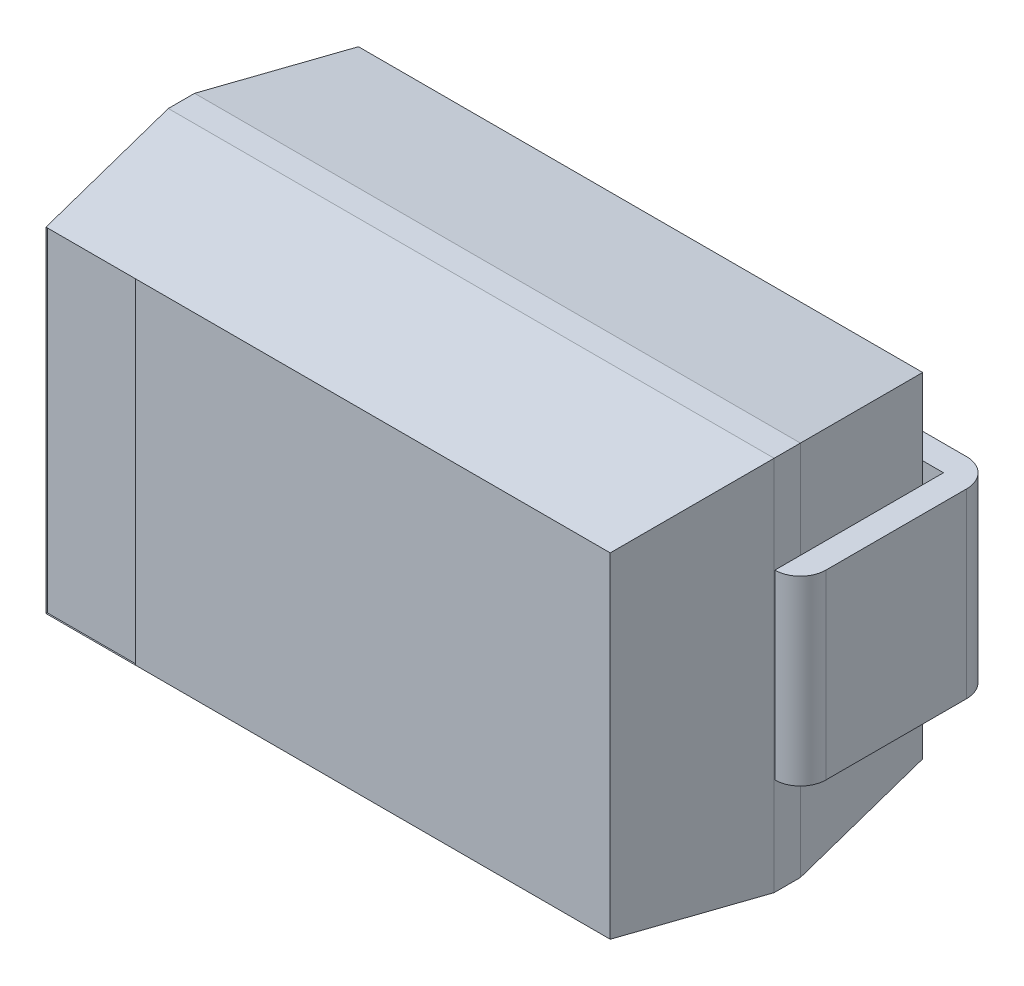
ISO-10303-21;
HEADER;
FILE_DESCRIPTION(('STEP AP214'),'2;1');
FILE_NAME('part.step','',(''),(''),'','','');
FILE_SCHEMA(('AUTOMOTIVE_DESIGN { 1 0 10303 214 1 1 1 1 }'));
ENDSEC;
DATA;
#1=APPLICATION_CONTEXT('core data for automotive mechanical design processes');
#2=APPLICATION_PROTOCOL_DEFINITION('international standard','automotive_design',2000,#1);
#3=PRODUCT_CONTEXT('',#1,'mechanical');
#4=PRODUCT('Part','Part','',(#3));
#5=PRODUCT_RELATED_PRODUCT_CATEGORY('part','',(#4));
#6=PRODUCT_DEFINITION_FORMATION('','',#4);
#7=PRODUCT_DEFINITION_CONTEXT('part definition',#1,'design');
#8=PRODUCT_DEFINITION('design','',#6,#7);
#9=PRODUCT_DEFINITION_SHAPE('','',#8);
#10=(LENGTH_UNIT() NAMED_UNIT(*) SI_UNIT(.MILLI.,.METRE.));
#11=(NAMED_UNIT(*) PLANE_ANGLE_UNIT() SI_UNIT($,.RADIAN.));
#12=(NAMED_UNIT(*) SI_UNIT($,.STERADIAN.) SOLID_ANGLE_UNIT());
#13=UNCERTAINTY_MEASURE_WITH_UNIT(LENGTH_MEASURE(1.E-05),#10,'distance_accuracy_value','');
#14=(GEOMETRIC_REPRESENTATION_CONTEXT(3) GLOBAL_UNCERTAINTY_ASSIGNED_CONTEXT((#13)) GLOBAL_UNIT_ASSIGNED_CONTEXT((#10,
#11,#12)) REPRESENTATION_CONTEXT('',''));
#15=CARTESIAN_POINT('',(0.,0.,0.));
#16=DIRECTION('',(0.,0.,1.));
#17=DIRECTION('',(1.,0.,0.));
#18=AXIS2_PLACEMENT_3D('',#15,#16,#17);
#19=CARTESIAN_POINT('',(1.44,-0.7125,0.));
#20=DIRECTION('',(-1.,0.,0.));
#21=DIRECTION('',(0.,0.,-1.));
#22=AXIS2_PLACEMENT_3D('',#19,#20,#21);
#23=PLANE('',#22);
#24=DIRECTION('',(0.,1.,0.));
#25=VECTOR('',#24,1.);
#26=CARTESIAN_POINT('',(1.44,-0.7125,0.));
#27=LINE('',#26,#25);
#28=CARTESIAN_POINT('',(1.44,-0.7125,0.));
#29=VERTEX_POINT('',#28);
#30=CARTESIAN_POINT('',(1.44,0.7125,0.));
#31=VERTEX_POINT('',#30);
#32=EDGE_CURVE('E51',#29,#31,#27,.T.);
#33=ORIENTED_EDGE('',*,*,#32,.F.);
#34=DIRECTION('',(0.,0.,-1.));
#35=VECTOR('',#34,1.);
#36=CARTESIAN_POINT('',(1.44,-0.7125,0.));
#37=LINE('',#36,#35);
#38=CARTESIAN_POINT('',(1.44,-0.7125,0.2));
#39=VERTEX_POINT('',#38);
#40=EDGE_CURVE('E164',#39,#29,#37,.T.);
#41=ORIENTED_EDGE('',*,*,#40,.F.);
#42=DIRECTION('',(0.,1.,0.));
#43=VECTOR('',#42,1.);
#44=CARTESIAN_POINT('',(1.44,-0.7125,0.2));
#45=LINE('',#44,#43);
#46=CARTESIAN_POINT('',(1.44,0.7125,0.2));
#47=VERTEX_POINT('',#46);
#48=EDGE_CURVE('E12',#39,#47,#45,.T.);
#49=ORIENTED_EDGE('',*,*,#48,.T.);
#50=DIRECTION('',(0.,0.,-1.));
#51=VECTOR('',#50,1.);
#52=CARTESIAN_POINT('',(1.44,0.7125,0.));
#53=LINE('',#52,#51);
#54=EDGE_CURVE('E112',#47,#31,#53,.T.);
#55=ORIENTED_EDGE('',*,*,#54,.T.);
#56=EDGE_LOOP('',(#33,#41,#49,#55));
#57=FACE_BOUND('',#56,.T.);
#58=ADVANCED_FACE('F48',(#57),#23,.T.);
#59=CARTESIAN_POINT('',(1.44,-0.7125,0.2));
#60=DIRECTION('',(0.,0.,1.));
#61=DIRECTION('',(-1.,0.,0.));
#62=AXIS2_PLACEMENT_3D('',#59,#60,#61);
#63=PLANE('',#62);
#64=ORIENTED_EDGE('',*,*,#48,.F.);
#65=DIRECTION('',(-1.,0.,0.));
#66=VECTOR('',#65,1.);
#67=CARTESIAN_POINT('',(1.44,-0.7125,0.2));
#68=LINE('',#67,#66);
#69=CARTESIAN_POINT('',(2.375,-0.7125,0.2));
#70=VERTEX_POINT('',#69);
#71=EDGE_CURVE('E64',#70,#39,#68,.T.);
#72=ORIENTED_EDGE('',*,*,#71,.F.);
#73=DIRECTION('',(0.,1.,0.));
#74=VECTOR('',#73,1.);
#75=CARTESIAN_POINT('',(2.375,-0.7125,0.2));
#76=LINE('',#75,#74);
#77=CARTESIAN_POINT('',(2.375,0.7125,0.2));
#78=VERTEX_POINT('',#77);
#79=EDGE_CURVE('E56',#70,#78,#76,.T.);
#80=ORIENTED_EDGE('',*,*,#79,.T.);
#81=DIRECTION('',(-1.,0.,0.));
#82=VECTOR('',#81,1.);
#83=CARTESIAN_POINT('',(1.44,0.7125,0.2));
#84=LINE('',#83,#82);
#85=EDGE_CURVE('E162',#78,#47,#84,.T.);
#86=ORIENTED_EDGE('',*,*,#85,.T.);
#87=EDGE_LOOP('',(#64,#72,#80,#86));
#88=FACE_BOUND('',#87,.T.);
#89=ADVANCED_FACE('F176',(#88),#63,.T.);
#90=CARTESIAN_POINT('',(2.375,-0.7125,0.2));
#91=DIRECTION('',(-1.,0.,0.));
#92=DIRECTION('',(0.,0.,-1.));
#93=AXIS2_PLACEMENT_3D('',#90,#91,#92);
#94=PLANE('',#93);
#95=ORIENTED_EDGE('',*,*,#79,.F.);
#96=DIRECTION('',(0.,0.,-1.));
#97=VECTOR('',#96,1.);
#98=CARTESIAN_POINT('',(2.375,-0.7125,1.32200000000003));
#99=LINE('',#98,#97);
#100=CARTESIAN_POINT('',(2.375,-0.7125,1.52200000000003));
#101=VERTEX_POINT('',#100);
#102=EDGE_CURVE('E69',#101,#70,#99,.T.);
#103=ORIENTED_EDGE('',*,*,#102,.F.);
#104=DIRECTION('',(0.,1.,0.));
#105=VECTOR('',#104,1.);
#106=CARTESIAN_POINT('',(2.375,-0.7125,1.52200000000003));
#107=LINE('',#106,#105);
#108=CARTESIAN_POINT('',(2.375,0.7125,1.52200000000003));
#109=VERTEX_POINT('',#108);
#110=EDGE_CURVE('E135',#101,#109,#107,.T.);
#111=ORIENTED_EDGE('',*,*,#110,.T.);
#112=DIRECTION('',(0.,0.,-1.));
#113=VECTOR('',#112,1.);
#114=CARTESIAN_POINT('',(2.375,0.7125,1.32200000000003));
#115=LINE('',#114,#113);
#116=EDGE_CURVE('E158',#109,#78,#115,.T.);
#117=ORIENTED_EDGE('',*,*,#116,.T.);
#118=EDGE_LOOP('',(#95,#103,#111,#117));
#119=FACE_BOUND('',#118,.T.);
#120=ADVANCED_FACE('F174',(#119),#94,.T.);
#121=CARTESIAN_POINT('',(2.375,-0.7125,1.32200000000003));
#122=DIRECTION('',(0.,1.,0.));
#123=DIRECTION('',(0.,0.,1.));
#124=AXIS2_PLACEMENT_3D('',#121,#122,#123);
#125=CYLINDRICAL_SURFACE('',#124,0.2);
#126=ORIENTED_EDGE('',*,*,#110,.F.);
#127=CARTESIAN_POINT('',(2.375,-0.7125,1.32200000000003));
#128=DIRECTION('',(0.,-1.,0.));
#129=DIRECTION('',(0.,0.,-1.));
#130=AXIS2_PLACEMENT_3D('',#127,#128,#129);
#131=CIRCLE('',#130,0.2);
#132=CARTESIAN_POINT('',(2.575,-0.7125,1.32200000000003));
#133=VERTEX_POINT('',#132);
#134=EDGE_CURVE('E129',#133,#101,#131,.T.);
#135=ORIENTED_EDGE('',*,*,#134,.F.);
#136=DIRECTION('',(0.,1.,0.));
#137=VECTOR('',#136,1.);
#138=CARTESIAN_POINT('',(2.575,-0.7125,1.32200000000003));
#139=LINE('',#138,#137);
#140=CARTESIAN_POINT('',(2.575,0.7125,1.32200000000003));
#141=VERTEX_POINT('',#140);
#142=EDGE_CURVE('E138',#133,#141,#139,.T.);
#143=ORIENTED_EDGE('',*,*,#142,.T.);
#144=CARTESIAN_POINT('',(2.375,0.7125,1.32200000000003));
#145=DIRECTION('',(0.,-1.,0.));
#146=DIRECTION('',(0.,0.,-1.));
#147=AXIS2_PLACEMENT_3D('',#144,#145,#146);
#148=CIRCLE('',#147,0.2);
#149=EDGE_CURVE('E156',#141,#109,#148,.T.);
#150=ORIENTED_EDGE('',*,*,#149,.T.);
#151=EDGE_LOOP('',(#126,#135,#143,#150));
#152=FACE_BOUND('',#151,.T.);
#153=ADVANCED_FACE('F172',(#152),#125,.T.);
#154=CARTESIAN_POINT('',(2.575,-0.7125,1.32200000000003));
#155=DIRECTION('',(1.,0.,0.));
#156=DIRECTION('',(0.,0.,1.));
#157=AXIS2_PLACEMENT_3D('',#154,#155,#156);
#158=PLANE('',#157);
#159=ORIENTED_EDGE('',*,*,#142,.F.);
#160=DIRECTION('',(0.,0.,1.));
#161=VECTOR('',#160,1.);
#162=CARTESIAN_POINT('',(2.575,-0.7125,1.32200000000003));
#163=LINE('',#162,#161);
#164=CARTESIAN_POINT('',(2.575,-0.7125,0.22));
#165=VERTEX_POINT('',#164);
#166=EDGE_CURVE('E149',#165,#133,#163,.T.);
#167=ORIENTED_EDGE('',*,*,#166,.F.);
#168=DIRECTION('',(0.,1.,0.));
#169=VECTOR('',#168,1.);
#170=CARTESIAN_POINT('',(2.575,-0.7125,0.22));
#171=LINE('',#170,#169);
#172=CARTESIAN_POINT('',(2.575,0.7125,0.22));
#173=VERTEX_POINT('',#172);
#174=EDGE_CURVE('E127',#165,#173,#171,.T.);
#175=ORIENTED_EDGE('',*,*,#174,.T.);
#176=DIRECTION('',(0.,0.,1.));
#177=VECTOR('',#176,1.);
#178=CARTESIAN_POINT('',(2.575,0.7125,1.32200000000003));
#179=LINE('',#178,#177);
#180=EDGE_CURVE('E147',#173,#141,#179,.T.);
#181=ORIENTED_EDGE('',*,*,#180,.T.);
#182=EDGE_LOOP('',(#159,#167,#175,#181));
#183=FACE_BOUND('',#182,.T.);
#184=ADVANCED_FACE('F146',(#183),#158,.T.);
#185=CARTESIAN_POINT('',(2.355,-0.7125,0.22));
#186=DIRECTION('',(0.,1.,0.));
#187=DIRECTION('',(0.,0.,1.));
#188=AXIS2_PLACEMENT_3D('',#185,#186,#187);
#189=CYLINDRICAL_SURFACE('',#188,0.22);
#190=ORIENTED_EDGE('',*,*,#174,.F.);
#191=CARTESIAN_POINT('',(2.355,-0.7125,0.22));
#192=DIRECTION('',(0.,-1.,0.));
#193=DIRECTION('',(0.,0.,1.));
#194=AXIS2_PLACEMENT_3D('',#191,#192,#193);
#195=CIRCLE('',#194,0.22);
#196=CARTESIAN_POINT('',(2.355,-0.7125,0.));
#197=VERTEX_POINT('',#196);
#198=EDGE_CURVE('E153',#197,#165,#195,.T.);
#199=ORIENTED_EDGE('',*,*,#198,.F.);
#200=DIRECTION('',(0.,1.,0.));
#201=VECTOR('',#200,1.);
#202=CARTESIAN_POINT('',(2.355,-0.7125,0.));
#203=LINE('',#202,#201);
#204=CARTESIAN_POINT('',(2.355,0.7125,0.));
#205=VERTEX_POINT('',#204);
#206=EDGE_CURVE('E126',#197,#205,#203,.T.);
#207=ORIENTED_EDGE('',*,*,#206,.T.);
#208=CARTESIAN_POINT('',(2.355,0.7125,0.22));
#209=DIRECTION('',(0.,-1.,0.));
#210=DIRECTION('',(0.,0.,1.));
#211=AXIS2_PLACEMENT_3D('',#208,#209,#210);
#212=CIRCLE('',#211,0.22);
#213=EDGE_CURVE('E114',#205,#173,#212,.T.);
#214=ORIENTED_EDGE('',*,*,#213,.T.);
#215=EDGE_LOOP('',(#190,#199,#207,#214));
#216=FACE_BOUND('',#215,.T.);
#217=ADVANCED_FACE('F152',(#216),#189,.T.);
#218=CARTESIAN_POINT('',(1.44,-0.7125,0.));
#219=DIRECTION('',(0.,0.,-1.));
#220=DIRECTION('',(1.,0.,0.));
#221=AXIS2_PLACEMENT_3D('',#218,#219,#220);
#222=PLANE('',#221);
#223=ORIENTED_EDGE('',*,*,#206,.F.);
#224=DIRECTION('',(1.,0.,0.));
#225=VECTOR('',#224,1.);
#226=CARTESIAN_POINT('',(1.44,-0.7125,0.));
#227=LINE('',#226,#225);
#228=EDGE_CURVE('E125',#29,#197,#227,.T.);
#229=ORIENTED_EDGE('',*,*,#228,.F.);
#230=ORIENTED_EDGE('',*,*,#32,.T.);
#231=DIRECTION('',(1.,0.,0.));
#232=VECTOR('',#231,1.);
#233=CARTESIAN_POINT('',(1.44,0.7125,0.));
#234=LINE('',#233,#232);
#235=EDGE_CURVE('E108',#31,#205,#234,.T.);
#236=ORIENTED_EDGE('',*,*,#235,.T.);
#237=EDGE_LOOP('',(#223,#229,#230,#236));
#238=FACE_BOUND('',#237,.T.);
#239=ADVANCED_FACE('F124',(#238),#222,.T.);
#240=CARTESIAN_POINT('',(2.375,-0.7125,1.32200000000003));
#241=DIRECTION('',(0.,-1.,0.));
#242=DIRECTION('',(0.,0.,-1.));
#243=AXIS2_PLACEMENT_3D('',#240,#241,#242);
#244=PLANE('',#243);
#245=ORIENTED_EDGE('',*,*,#40,.T.);
#246=ORIENTED_EDGE('',*,*,#228,.T.);
#247=ORIENTED_EDGE('',*,*,#198,.T.);
#248=ORIENTED_EDGE('',*,*,#166,.T.);
#249=ORIENTED_EDGE('',*,*,#134,.T.);
#250=ORIENTED_EDGE('',*,*,#102,.T.);
#251=ORIENTED_EDGE('',*,*,#71,.T.);
#252=EDGE_LOOP('',(#245,#246,#247,#248,#249,#250,#251));
#253=FACE_BOUND('',#252,.T.);
#254=ADVANCED_FACE('F170',(#253),#244,.T.);
#255=CARTESIAN_POINT('',(2.375,0.7125,1.32200000000003));
#256=DIRECTION('',(0.,-1.,0.));
#257=DIRECTION('',(0.,0.,-1.));
#258=AXIS2_PLACEMENT_3D('',#255,#256,#257);
#259=PLANE('',#258);
#260=ORIENTED_EDGE('',*,*,#54,.F.);
#261=ORIENTED_EDGE('',*,*,#85,.F.);
#262=ORIENTED_EDGE('',*,*,#116,.F.);
#263=ORIENTED_EDGE('',*,*,#149,.F.);
#264=ORIENTED_EDGE('',*,*,#180,.F.);
#265=ORIENTED_EDGE('',*,*,#213,.F.);
#266=ORIENTED_EDGE('',*,*,#235,.F.);
#267=EDGE_LOOP('',(#260,#261,#262,#263,#264,#265,#266));
#268=FACE_BOUND('',#267,.T.);
#269=ADVANCED_FACE('F110',(#268),#259,.F.);
#270=CLOSED_SHELL('',(#58,#89,#120,#153,#184,#217,#239,#254,#269));
#271=MANIFOLD_SOLID_BREP('B2',#270);
#272=CARTESIAN_POINT('',(-1.44,-0.7125,0.));
#273=DIRECTION('',(1.,0.,0.));
#274=DIRECTION('',(0.,0.,-1.));
#275=AXIS2_PLACEMENT_3D('',#272,#273,#274);
#276=PLANE('',#275);
#277=DIRECTION('',(0.,1.,0.));
#278=VECTOR('',#277,1.);
#279=CARTESIAN_POINT('',(-1.44,-0.7125,0.));
#280=LINE('',#279,#278);
#281=CARTESIAN_POINT('',(-1.44,-0.7125,0.));
#282=VERTEX_POINT('',#281);
#283=CARTESIAN_POINT('',(-1.44,0.7125,0.));
#284=VERTEX_POINT('',#283);
#285=EDGE_CURVE('E283',#282,#284,#280,.T.);
#286=ORIENTED_EDGE('',*,*,#285,.T.);
#287=DIRECTION('',(0.,0.,-1.));
#288=VECTOR('',#287,1.);
#289=CARTESIAN_POINT('',(-1.44,0.7125,0.));
#290=LINE('',#289,#288);
#291=CARTESIAN_POINT('',(-1.44,0.7125,0.2));
#292=VERTEX_POINT('',#291);
#293=EDGE_CURVE('E338',#292,#284,#290,.T.);
#294=ORIENTED_EDGE('',*,*,#293,.F.);
#295=DIRECTION('',(0.,1.,0.));
#296=VECTOR('',#295,1.);
#297=CARTESIAN_POINT('',(-1.44,-0.7125,0.2));
#298=LINE('',#297,#296);
#299=CARTESIAN_POINT('',(-1.44,-0.7125,0.2));
#300=VERTEX_POINT('',#299);
#301=EDGE_CURVE('E46',#300,#292,#298,.T.);
#302=ORIENTED_EDGE('',*,*,#301,.F.);
#303=DIRECTION('',(0.,0.,-1.));
#304=VECTOR('',#303,1.);
#305=CARTESIAN_POINT('',(-1.44,-0.7125,0.));
#306=LINE('',#305,#304);
#307=EDGE_CURVE('E339',#300,#282,#306,.T.);
#308=ORIENTED_EDGE('',*,*,#307,.T.);
#309=EDGE_LOOP('',(#286,#294,#302,#308));
#310=FACE_BOUND('',#309,.T.);
#311=ADVANCED_FACE('F280',(#310),#276,.T.);
#312=CARTESIAN_POINT('',(-1.44,-0.7125,0.2));
#313=DIRECTION('',(0.,0.,1.));
#314=DIRECTION('',(1.,0.,0.));
#315=AXIS2_PLACEMENT_3D('',#312,#313,#314);
#316=PLANE('',#315);
#317=ORIENTED_EDGE('',*,*,#301,.T.);
#318=DIRECTION('',(1.,0.,0.));
#319=VECTOR('',#318,1.);
#320=CARTESIAN_POINT('',(-1.44,0.7125,0.2));
#321=LINE('',#320,#319);
#322=CARTESIAN_POINT('',(-2.375,0.7125,0.2));
#323=VERTEX_POINT('',#322);
#324=EDGE_CURVE('E357',#323,#292,#321,.T.);
#325=ORIENTED_EDGE('',*,*,#324,.F.);
#326=DIRECTION('',(0.,1.,0.));
#327=VECTOR('',#326,1.);
#328=CARTESIAN_POINT('',(-2.375,-0.7125,0.2));
#329=LINE('',#328,#327);
#330=CARTESIAN_POINT('',(-2.375,-0.7125,0.2));
#331=VERTEX_POINT('',#330);
#332=EDGE_CURVE('E288',#331,#323,#329,.T.);
#333=ORIENTED_EDGE('',*,*,#332,.F.);
#334=DIRECTION('',(1.,0.,0.));
#335=VECTOR('',#334,1.);
#336=CARTESIAN_POINT('',(-1.44,-0.7125,0.2));
#337=LINE('',#336,#335);
#338=EDGE_CURVE('E344',#331,#300,#337,.T.);
#339=ORIENTED_EDGE('',*,*,#338,.T.);
#340=EDGE_LOOP('',(#317,#325,#333,#339));
#341=FACE_BOUND('',#340,.T.);
#342=ADVANCED_FACE('F406',(#341),#316,.T.);
#343=CARTESIAN_POINT('',(-2.375,-0.7125,0.2));
#344=DIRECTION('',(1.,0.,0.));
#345=DIRECTION('',(0.,0.,-1.));
#346=AXIS2_PLACEMENT_3D('',#343,#344,#345);
#347=PLANE('',#346);
#348=ORIENTED_EDGE('',*,*,#332,.T.);
#349=DIRECTION('',(0.,0.,-1.));
#350=VECTOR('',#349,1.);
#351=CARTESIAN_POINT('',(-2.375,0.7125,1.32200000000003));
#352=LINE('',#351,#350);
#353=CARTESIAN_POINT('',(-2.375,0.7125,1.52200000000003));
#354=VERTEX_POINT('',#353);
#355=EDGE_CURVE('E367',#354,#323,#352,.T.);
#356=ORIENTED_EDGE('',*,*,#355,.F.);
#357=DIRECTION('',(0.,1.,0.));
#358=VECTOR('',#357,1.);
#359=CARTESIAN_POINT('',(-2.375,-0.7125,1.52200000000003));
#360=LINE('',#359,#358);
#361=CARTESIAN_POINT('',(-2.375,-0.7125,1.52200000000003));
#362=VERTEX_POINT('',#361);
#363=EDGE_CURVE('E386',#362,#354,#360,.T.);
#364=ORIENTED_EDGE('',*,*,#363,.F.);
#365=DIRECTION('',(0.,0.,-1.));
#366=VECTOR('',#365,1.);
#367=CARTESIAN_POINT('',(-2.375,-0.7125,1.32200000000003));
#368=LINE('',#367,#366);
#369=EDGE_CURVE('E302',#362,#331,#368,.T.);
#370=ORIENTED_EDGE('',*,*,#369,.T.);
#371=EDGE_LOOP('',(#348,#356,#364,#370));
#372=FACE_BOUND('',#371,.T.);
#373=ADVANCED_FACE('F408',(#372),#347,.T.);
#374=CARTESIAN_POINT('',(-2.375,-0.7125,1.32200000000003));
#375=DIRECTION('',(0.,1.,0.));
#376=DIRECTION('',(0.,0.,1.));
#377=AXIS2_PLACEMENT_3D('',#374,#375,#376);
#378=CYLINDRICAL_SURFACE('',#377,0.2);
#379=ORIENTED_EDGE('',*,*,#363,.T.);
#380=CARTESIAN_POINT('',(-2.375,0.7125,1.32200000000003));
#381=DIRECTION('',(0.,1.,0.));
#382=DIRECTION('',(0.,0.,-1.));
#383=AXIS2_PLACEMENT_3D('',#380,#381,#382);
#384=CIRCLE('',#383,0.2);
#385=CARTESIAN_POINT('',(-2.575,0.7125,1.32200000000003));
#386=VERTEX_POINT('',#385);
#387=EDGE_CURVE('E364',#386,#354,#384,.T.);
#388=ORIENTED_EDGE('',*,*,#387,.F.);
#389=DIRECTION('',(0.,1.,0.));
#390=VECTOR('',#389,1.);
#391=CARTESIAN_POINT('',(-2.575,-0.7125,1.32200000000003));
#392=LINE('',#391,#390);
#393=CARTESIAN_POINT('',(-2.575,-0.7125,1.32200000000003));
#394=VERTEX_POINT('',#393);
#395=EDGE_CURVE('E388',#394,#386,#392,.T.);
#396=ORIENTED_EDGE('',*,*,#395,.F.);
#397=CARTESIAN_POINT('',(-2.375,-0.7125,1.32200000000003));
#398=DIRECTION('',(0.,1.,0.));
#399=DIRECTION('',(0.,0.,-1.));
#400=AXIS2_PLACEMENT_3D('',#397,#398,#399);
#401=CIRCLE('',#400,0.2);
#402=EDGE_CURVE('E379',#394,#362,#401,.T.);
#403=ORIENTED_EDGE('',*,*,#402,.T.);
#404=EDGE_LOOP('',(#379,#388,#396,#403));
#405=FACE_BOUND('',#404,.T.);
#406=ADVANCED_FACE('F401',(#405),#378,.T.);
#407=CARTESIAN_POINT('',(-2.575,-0.7125,1.32200000000003));
#408=DIRECTION('',(-1.,0.,0.));
#409=DIRECTION('',(0.,0.,1.));
#410=AXIS2_PLACEMENT_3D('',#407,#408,#409);
#411=PLANE('',#410);
#412=ORIENTED_EDGE('',*,*,#395,.T.);
#413=DIRECTION('',(0.,0.,1.));
#414=VECTOR('',#413,1.);
#415=CARTESIAN_POINT('',(-2.575,0.7125,1.32200000000003));
#416=LINE('',#415,#414);
#417=CARTESIAN_POINT('',(-2.575,0.7125,0.22));
#418=VERTEX_POINT('',#417);
#419=EDGE_CURVE('E361',#418,#386,#416,.T.);
#420=ORIENTED_EDGE('',*,*,#419,.F.);
#421=DIRECTION('',(0.,1.,0.));
#422=VECTOR('',#421,1.);
#423=CARTESIAN_POINT('',(-2.575,-0.7125,0.22));
#424=LINE('',#423,#422);
#425=CARTESIAN_POINT('',(-2.575,-0.7125,0.22));
#426=VERTEX_POINT('',#425);
#427=EDGE_CURVE('E390',#426,#418,#424,.T.);
#428=ORIENTED_EDGE('',*,*,#427,.F.);
#429=DIRECTION('',(0.,0.,1.));
#430=VECTOR('',#429,1.);
#431=CARTESIAN_POINT('',(-2.575,-0.7125,1.32200000000003));
#432=LINE('',#431,#430);
#433=EDGE_CURVE('E376',#426,#394,#432,.T.);
#434=ORIENTED_EDGE('',*,*,#433,.T.);
#435=EDGE_LOOP('',(#412,#420,#428,#434));
#436=FACE_BOUND('',#435,.T.);
#437=ADVANCED_FACE('F398',(#436),#411,.T.);
#438=CARTESIAN_POINT('',(-2.355,-0.7125,0.22));
#439=DIRECTION('',(0.,1.,0.));
#440=DIRECTION('',(0.,0.,1.));
#441=AXIS2_PLACEMENT_3D('',#438,#439,#440);
#442=CYLINDRICAL_SURFACE('',#441,0.22);
#443=ORIENTED_EDGE('',*,*,#427,.T.);
#444=CARTESIAN_POINT('',(-2.355,0.7125,0.22));
#445=DIRECTION('',(0.,1.,0.));
#446=DIRECTION('',(0.,0.,1.));
#447=AXIS2_PLACEMENT_3D('',#444,#445,#446);
#448=CIRCLE('',#447,0.22);
#449=CARTESIAN_POINT('',(-2.355,0.7125,0.));
#450=VERTEX_POINT('',#449);
#451=EDGE_CURVE('E351',#450,#418,#448,.T.);
#452=ORIENTED_EDGE('',*,*,#451,.F.);
#453=DIRECTION('',(0.,1.,0.));
#454=VECTOR('',#453,1.);
#455=CARTESIAN_POINT('',(-2.355,-0.7125,0.));
#456=LINE('',#455,#454);
#457=CARTESIAN_POINT('',(-2.355,-0.7125,0.));
#458=VERTEX_POINT('',#457);
#459=EDGE_CURVE('E343',#458,#450,#456,.T.);
#460=ORIENTED_EDGE('',*,*,#459,.F.);
#461=CARTESIAN_POINT('',(-2.355,-0.7125,0.22));
#462=DIRECTION('',(0.,1.,0.));
#463=DIRECTION('',(0.,0.,1.));
#464=AXIS2_PLACEMENT_3D('',#461,#462,#463);
#465=CIRCLE('',#464,0.22);
#466=EDGE_CURVE('E373',#458,#426,#465,.T.);
#467=ORIENTED_EDGE('',*,*,#466,.T.);
#468=EDGE_LOOP('',(#443,#452,#460,#467));
#469=FACE_BOUND('',#468,.T.);
#470=ADVANCED_FACE('F392',(#469),#442,.T.);
#471=CARTESIAN_POINT('',(-1.44,-0.7125,0.));
#472=DIRECTION('',(0.,0.,-1.));
#473=DIRECTION('',(-1.,0.,0.));
#474=AXIS2_PLACEMENT_3D('',#471,#472,#473);
#475=PLANE('',#474);
#476=ORIENTED_EDGE('',*,*,#459,.T.);
#477=DIRECTION('',(-1.,0.,0.));
#478=VECTOR('',#477,1.);
#479=CARTESIAN_POINT('',(-1.44,0.7125,0.));
#480=LINE('',#479,#478);
#481=EDGE_CURVE('E346',#284,#450,#480,.T.);
#482=ORIENTED_EDGE('',*,*,#481,.F.);
#483=ORIENTED_EDGE('',*,*,#285,.F.);
#484=DIRECTION('',(-1.,0.,0.));
#485=VECTOR('',#484,1.);
#486=CARTESIAN_POINT('',(-1.44,-0.7125,0.));
#487=LINE('',#486,#485);
#488=EDGE_CURVE('E371',#282,#458,#487,.T.);
#489=ORIENTED_EDGE('',*,*,#488,.T.);
#490=EDGE_LOOP('',(#476,#482,#483,#489));
#491=FACE_BOUND('',#490,.T.);
#492=ADVANCED_FACE('F347',(#491),#475,.T.);
#493=CARTESIAN_POINT('',(-2.375,-0.7125,1.32200000000003));
#494=DIRECTION('',(0.,-1.,0.));
#495=DIRECTION('',(0.,0.,-1.));
#496=AXIS2_PLACEMENT_3D('',#493,#494,#495);
#497=PLANE('',#496);
#498=ORIENTED_EDGE('',*,*,#307,.F.);
#499=ORIENTED_EDGE('',*,*,#338,.F.);
#500=ORIENTED_EDGE('',*,*,#369,.F.);
#501=ORIENTED_EDGE('',*,*,#402,.F.);
#502=ORIENTED_EDGE('',*,*,#433,.F.);
#503=ORIENTED_EDGE('',*,*,#466,.F.);
#504=ORIENTED_EDGE('',*,*,#488,.F.);
#505=EDGE_LOOP('',(#498,#499,#500,#501,#502,#503,#504));
#506=FACE_BOUND('',#505,.T.);
#507=ADVANCED_FACE('F403',(#506),#497,.T.);
#508=CARTESIAN_POINT('',(-2.375,0.7125,1.32200000000003));
#509=DIRECTION('',(0.,-1.,0.));
#510=DIRECTION('',(0.,0.,-1.));
#511=AXIS2_PLACEMENT_3D('',#508,#509,#510);
#512=PLANE('',#511);
#513=ORIENTED_EDGE('',*,*,#293,.T.);
#514=ORIENTED_EDGE('',*,*,#481,.T.);
#515=ORIENTED_EDGE('',*,*,#451,.T.);
#516=ORIENTED_EDGE('',*,*,#419,.T.);
#517=ORIENTED_EDGE('',*,*,#387,.T.);
#518=ORIENTED_EDGE('',*,*,#355,.T.);
#519=ORIENTED_EDGE('',*,*,#324,.T.);
#520=EDGE_LOOP('',(#513,#514,#515,#516,#517,#518,#519));
#521=FACE_BOUND('',#520,.T.);
#522=ADVANCED_FACE('F354',(#521),#512,.F.);
#523=CLOSED_SHELL('',(#311,#342,#373,#406,#437,#470,#492,#507,#522));
#524=MANIFOLD_SOLID_BREP('B6',#523);
#525=CARTESIAN_POINT('',(2.375,1.475,2.65));
#526=DIRECTION('',(-1.,0.,0.));
#527=DIRECTION('',(0.,-1.,0.));
#528=AXIS2_PLACEMENT_3D('',#525,#526,#527);
#529=PLANE('',#528);
#530=DIRECTION('',(0.,0.,-1.));
#531=VECTOR('',#530,1.);
#532=CARTESIAN_POINT('',(2.375,-1.475,2.65));
#533=LINE('',#532,#531);
#534=CARTESIAN_POINT('',(2.375,-1.475,1.52799999999998));
#535=VERTEX_POINT('',#534);
#536=CARTESIAN_POINT('',(2.375,-1.475,1.32200000000003));
#537=VERTEX_POINT('',#536);
#538=EDGE_CURVE('E608',#535,#537,#533,.T.);
#539=ORIENTED_EDGE('',*,*,#538,.T.);
#540=DIRECTION('',(0.,1.,0.));
#541=VECTOR('',#540,1.);
#542=CARTESIAN_POINT('',(2.375,1.475,1.32200000000003));
#543=LINE('',#542,#541);
#544=CARTESIAN_POINT('',(2.375,1.475,1.32200000000003));
#545=VERTEX_POINT('',#544);
#546=EDGE_CURVE('E637',#537,#545,#543,.T.);
#547=ORIENTED_EDGE('',*,*,#546,.T.);
#548=DIRECTION('',(0.,0.,-1.));
#549=VECTOR('',#548,1.);
#550=CARTESIAN_POINT('',(2.375,1.475,2.65));
#551=LINE('',#550,#549);
#552=CARTESIAN_POINT('',(2.375,1.475,1.52799999999998));
#553=VERTEX_POINT('',#552);
#554=EDGE_CURVE('E616',#553,#545,#551,.T.);
#555=ORIENTED_EDGE('',*,*,#554,.F.);
#556=DIRECTION('',(0.,-1.,0.));
#557=VECTOR('',#556,1.);
#558=CARTESIAN_POINT('',(2.375,-1.475,1.52799999999998));
#559=LINE('',#558,#557);
#560=EDGE_CURVE('E631',#553,#535,#559,.T.);
#561=ORIENTED_EDGE('',*,*,#560,.T.);
#562=EDGE_LOOP('',(#539,#547,#555,#561));
#563=FACE_BOUND('',#562,.T.);
#564=ADVANCED_FACE('F485',(#563),#529,.F.);
#565=CARTESIAN_POINT('',(-2.375,1.475,2.65));
#566=DIRECTION('',(0.,-1.,0.));
#567=DIRECTION('',(0.,0.,-1.));
#568=AXIS2_PLACEMENT_3D('',#565,#566,#567);
#569=PLANE('',#568);
#570=ORIENTED_EDGE('',*,*,#554,.T.);
#571=DIRECTION('',(-1.,0.,0.));
#572=VECTOR('',#571,1.);
#573=CARTESIAN_POINT('',(-2.375,1.475,1.32200000000003));
#574=LINE('',#573,#572);
#575=CARTESIAN_POINT('',(-2.375,1.475,1.32200000000003));
#576=VERTEX_POINT('',#575);
#577=EDGE_CURVE('E659',#545,#576,#574,.T.);
#578=ORIENTED_EDGE('',*,*,#577,.T.);
#579=DIRECTION('',(0.,0.,-1.));
#580=VECTOR('',#579,1.);
#581=CARTESIAN_POINT('',(-2.375,1.475,2.65));
#582=LINE('',#581,#580);
#583=CARTESIAN_POINT('',(-2.375,1.475,1.52799999999998));
#584=VERTEX_POINT('',#583);
#585=EDGE_CURVE('E614',#584,#576,#582,.T.);
#586=ORIENTED_EDGE('',*,*,#585,.F.);
#587=DIRECTION('',(1.,0.,0.));
#588=VECTOR('',#587,1.);
#589=CARTESIAN_POINT('',(2.375,1.475,1.52799999999998));
#590=LINE('',#589,#588);
#591=EDGE_CURVE('E628',#584,#553,#590,.T.);
#592=ORIENTED_EDGE('',*,*,#591,.T.);
#593=EDGE_LOOP('',(#570,#578,#586,#592));
#594=FACE_BOUND('',#593,.T.);
#595=ADVANCED_FACE('F692',(#594),#569,.F.);
#596=CARTESIAN_POINT('',(-2.375,1.475,2.65));
#597=DIRECTION('',(1.,0.,0.));
#598=DIRECTION('',(0.,0.,-1.));
#599=AXIS2_PLACEMENT_3D('',#596,#597,#598);
#600=PLANE('',#599);
#601=ORIENTED_EDGE('',*,*,#585,.T.);
#602=DIRECTION('',(0.,-1.,0.));
#603=VECTOR('',#602,1.);
#604=CARTESIAN_POINT('',(-2.375,1.475,1.32200000000003));
#605=LINE('',#604,#603);
#606=CARTESIAN_POINT('',(-2.375,-1.475,1.32200000000003));
#607=VERTEX_POINT('',#606);
#608=EDGE_CURVE('E278',#576,#607,#605,.T.);
#609=ORIENTED_EDGE('',*,*,#608,.T.);
#610=DIRECTION('',(0.,0.,-1.));
#611=VECTOR('',#610,1.);
#612=CARTESIAN_POINT('',(-2.375,-1.475,2.65));
#613=LINE('',#612,#611);
#614=CARTESIAN_POINT('',(-2.375,-1.475,1.52799999999998));
#615=VERTEX_POINT('',#614);
#616=EDGE_CURVE('E611',#615,#607,#613,.T.);
#617=ORIENTED_EDGE('',*,*,#616,.F.);
#618=DIRECTION('',(0.,1.,0.));
#619=VECTOR('',#618,1.);
#620=CARTESIAN_POINT('',(-2.375,1.475,1.52799999999998));
#621=LINE('',#620,#619);
#622=EDGE_CURVE('E635',#615,#584,#621,.T.);
#623=ORIENTED_EDGE('',*,*,#622,.T.);
#624=EDGE_LOOP('',(#601,#609,#617,#623));
#625=FACE_BOUND('',#624,.T.);
#626=ADVANCED_FACE('F729',(#625),#600,.F.);
#627=CARTESIAN_POINT('',(-2.375,-1.475,2.65));
#628=DIRECTION('',(0.,1.,0.));
#629=DIRECTION('',(0.,0.,1.));
#630=AXIS2_PLACEMENT_3D('',#627,#628,#629);
#631=PLANE('',#630);
#632=ORIENTED_EDGE('',*,*,#616,.T.);
#633=DIRECTION('',(1.,0.,0.));
#634=VECTOR('',#633,1.);
#635=CARTESIAN_POINT('',(-2.375,-1.475,1.32200000000003));
#636=LINE('',#635,#634);
#637=EDGE_CURVE('E494',#607,#537,#636,.T.);
#638=ORIENTED_EDGE('',*,*,#637,.T.);
#639=ORIENTED_EDGE('',*,*,#538,.F.);
#640=DIRECTION('',(-1.,0.,0.));
#641=VECTOR('',#640,1.);
#642=CARTESIAN_POINT('',(-2.375,-1.475,1.52799999999998));
#643=LINE('',#642,#641);
#644=EDGE_CURVE('E633',#535,#615,#643,.T.);
#645=ORIENTED_EDGE('',*,*,#644,.T.);
#646=EDGE_LOOP('',(#632,#638,#639,#645));
#647=FACE_BOUND('',#646,.T.);
#648=ADVANCED_FACE('F782',(#647),#631,.F.);
#649=CARTESIAN_POINT('',(0.,0.,2.65));
#650=DIRECTION('',(0.,0.,1.));
#651=DIRECTION('',(1.,0.,0.));
#652=AXIS2_PLACEMENT_3D('',#649,#650,#651);
#653=PLANE('',#652);
#654=DIRECTION('',(0.,1.,0.));
#655=VECTOR('',#654,1.);
#656=CARTESIAN_POINT('',(-1.512,-1.312,2.65));
#657=LINE('',#656,#655);
#658=CARTESIAN_POINT('',(-1.512,-1.312,2.65));
#659=VERTEX_POINT('',#658);
#660=CARTESIAN_POINT('',(-1.512,1.312,2.65));
#661=VERTEX_POINT('',#660);
#662=EDGE_CURVE('E502',#659,#661,#657,.T.);
#663=ORIENTED_EDGE('',*,*,#662,.F.);
#664=DIRECTION('',(1.,0.,0.));
#665=VECTOR('',#664,1.);
#666=CARTESIAN_POINT('',(2.375,-1.312,2.65));
#667=LINE('',#666,#665);
#668=CARTESIAN_POINT('',(2.212,-1.312,2.65));
#669=VERTEX_POINT('',#668);
#670=EDGE_CURVE('E620',#659,#669,#667,.T.);
#671=ORIENTED_EDGE('',*,*,#670,.T.);
#672=DIRECTION('',(0.,1.,0.));
#673=VECTOR('',#672,1.);
#674=CARTESIAN_POINT('',(2.212,1.475,2.65));
#675=LINE('',#674,#673);
#676=CARTESIAN_POINT('',(2.212,1.312,2.65));
#677=VERTEX_POINT('',#676);
#678=EDGE_CURVE('E623',#669,#677,#675,.T.);
#679=ORIENTED_EDGE('',*,*,#678,.T.);
#680=DIRECTION('',(-1.,0.,0.));
#681=VECTOR('',#680,1.);
#682=CARTESIAN_POINT('',(-2.375,1.312,2.65));
#683=LINE('',#682,#681);
#684=EDGE_CURVE('E625',#677,#661,#683,.T.);
#685=ORIENTED_EDGE('',*,*,#684,.T.);
#686=EDGE_LOOP('',(#663,#671,#679,#685));
#687=FACE_BOUND('',#686,.T.);
#688=ADVANCED_FACE('F711',(#687),#653,.T.);
#689=CARTESIAN_POINT('',(0.,0.,0.2));
#690=DIRECTION('',(0.,0.,1.));
#691=DIRECTION('',(1.,0.,0.));
#692=AXIS2_PLACEMENT_3D('',#689,#690,#691);
#693=PLANE('',#692);
#694=DIRECTION('',(1.,0.,0.));
#695=VECTOR('',#694,1.);
#696=CARTESIAN_POINT('',(0.,1.312,0.2));
#697=LINE('',#696,#695);
#698=CARTESIAN_POINT('',(-2.212,1.312,0.2));
#699=VERTEX_POINT('',#698);
#700=CARTESIAN_POINT('',(2.212,1.312,0.2));
#701=VERTEX_POINT('',#700);
#702=EDGE_CURVE('E654',#699,#701,#697,.T.);
#703=ORIENTED_EDGE('',*,*,#702,.T.);
#704=DIRECTION('',(0.,-1.,0.));
#705=VECTOR('',#704,1.);
#706=CARTESIAN_POINT('',(2.212,0.,0.2));
#707=LINE('',#706,#705);
#708=CARTESIAN_POINT('',(2.212,-1.312,0.2));
#709=VERTEX_POINT('',#708);
#710=EDGE_CURVE('E656',#701,#709,#707,.T.);
#711=ORIENTED_EDGE('',*,*,#710,.T.);
#712=DIRECTION('',(-1.,0.,0.));
#713=VECTOR('',#712,1.);
#714=CARTESIAN_POINT('',(0.,-1.312,0.2));
#715=LINE('',#714,#713);
#716=CARTESIAN_POINT('',(-2.212,-1.312,0.2));
#717=VERTEX_POINT('',#716);
#718=EDGE_CURVE('E652',#709,#717,#715,.T.);
#719=ORIENTED_EDGE('',*,*,#718,.T.);
#720=DIRECTION('',(0.,1.,0.));
#721=VECTOR('',#720,1.);
#722=CARTESIAN_POINT('',(-2.212,0.,0.2));
#723=LINE('',#722,#721);
#724=EDGE_CURVE('E650',#717,#699,#723,.T.);
#725=ORIENTED_EDGE('',*,*,#724,.T.);
#726=EDGE_LOOP('',(#703,#711,#719,#725));
#727=FACE_BOUND('',#726,.T.);
#728=ADVANCED_FACE('F680',(#727),#693,.F.);
#729=CARTESIAN_POINT('',(0.,-1.312,2.65));
#730=DIRECTION('',(0.,-0.989611550976719,0.143767096977898));
#731=DIRECTION('',(-1.,0.,0.));
#732=AXIS2_PLACEMENT_3D('',#729,#730,#731);
#733=PLANE('',#732);
#734=DIRECTION('',(0.142303979670659,0.142303979670659,0.97954027724223));
#735=VECTOR('',#734,1.);
#736=CARTESIAN_POINT('',(-2.1854314455093,-1.2854314455093,2.83288293336544));
#737=LINE('',#736,#735);
#738=CARTESIAN_POINT('',(-2.212,-1.312,2.65));
#739=VERTEX_POINT('',#738);
#740=EDGE_CURVE('E643',#615,#739,#737,.T.);
#741=ORIENTED_EDGE('',*,*,#740,.F.);
#742=ORIENTED_EDGE('',*,*,#644,.F.);
#743=DIRECTION('',(-0.142303979670659,0.142303979670659,0.97954027724223));
#744=VECTOR('',#743,1.);
#745=CARTESIAN_POINT('',(2.1672060651422,-1.2672060651422,2.95833616509479));
#746=LINE('',#745,#744);
#747=EDGE_CURVE('E612',#669,#535,#746,.F.);
#748=ORIENTED_EDGE('',*,*,#747,.F.);
#749=ORIENTED_EDGE('',*,*,#670,.F.);
#750=EDGE_CURVE('E621',#739,#659,#667,.T.);
#751=ORIENTED_EDGE('',*,*,#750,.F.);
#752=EDGE_LOOP('',(#741,#742,#748,#749,#751));
#753=FACE_BOUND('',#752,.T.);
#754=ADVANCED_FACE('F707',(#753),#733,.T.);
#755=CARTESIAN_POINT('',(2.212,0.,2.65));
#756=DIRECTION('',(0.989611550976719,0.,0.143767096977897));
#757=DIRECTION('',(0.,-1.,0.));
#758=AXIS2_PLACEMENT_3D('',#755,#756,#757);
#759=PLANE('',#758);
#760=ORIENTED_EDGE('',*,*,#747,.T.);
#761=ORIENTED_EDGE('',*,*,#560,.F.);
#762=DIRECTION('',(-0.142303979670659,-0.142303979670659,0.97954027724223));
#763=VECTOR('',#762,1.);
#764=CARTESIAN_POINT('',(2.1854314455093,1.2854314455093,2.83288293336544));
#765=LINE('',#764,#763);
#766=EDGE_CURVE('E641',#677,#553,#765,.F.);
#767=ORIENTED_EDGE('',*,*,#766,.F.);
#768=ORIENTED_EDGE('',*,*,#678,.F.);
#769=EDGE_LOOP('',(#760,#761,#767,#768));
#770=FACE_BOUND('',#769,.T.);
#771=ADVANCED_FACE('F737',(#770),#759,.T.);
#772=CARTESIAN_POINT('',(-2.212,0.,2.65));
#773=DIRECTION('',(-0.989611550976719,0.,0.143767096977898));
#774=DIRECTION('',(0.,1.,0.));
#775=AXIS2_PLACEMENT_3D('',#772,#773,#774);
#776=PLANE('',#775);
#777=ORIENTED_EDGE('',*,*,#740,.T.);
#778=DIRECTION('',(0.,-1.,0.));
#779=VECTOR('',#778,1.);
#780=CARTESIAN_POINT('',(-2.212,-1.475,2.65));
#781=LINE('',#780,#779);
#782=CARTESIAN_POINT('',(-2.212,1.312,2.65));
#783=VERTEX_POINT('',#782);
#784=EDGE_CURVE('E577',#783,#739,#781,.T.);
#785=ORIENTED_EDGE('',*,*,#784,.F.);
#786=DIRECTION('',(-0.142303979670659,0.142303979670659,-0.97954027724223));
#787=VECTOR('',#786,1.);
#788=CARTESIAN_POINT('',(-2.1854314455093,1.2854314455093,2.83288293336544));
#789=LINE('',#788,#787);
#790=EDGE_CURVE('E638',#584,#783,#789,.F.);
#791=ORIENTED_EDGE('',*,*,#790,.F.);
#792=ORIENTED_EDGE('',*,*,#622,.F.);
#793=EDGE_LOOP('',(#777,#785,#791,#792));
#794=FACE_BOUND('',#793,.T.);
#795=ADVANCED_FACE('F703',(#794),#776,.T.);
#796=CARTESIAN_POINT('',(0.,1.312,2.65));
#797=DIRECTION('',(0.,0.989611550976719,0.143767096977898));
#798=DIRECTION('',(1.,0.,0.));
#799=AXIS2_PLACEMENT_3D('',#796,#797,#798);
#800=PLANE('',#799);
#801=ORIENTED_EDGE('',*,*,#766,.T.);
#802=ORIENTED_EDGE('',*,*,#591,.F.);
#803=ORIENTED_EDGE('',*,*,#790,.T.);
#804=DIRECTION('',(-1.,0.,0.));
#805=VECTOR('',#804,1.);
#806=CARTESIAN_POINT('',(-2.212,1.312,2.65));
#807=LINE('',#806,#805);
#808=EDGE_CURVE('E594',#661,#783,#807,.T.);
#809=ORIENTED_EDGE('',*,*,#808,.F.);
#810=ORIENTED_EDGE('',*,*,#684,.F.);
#811=EDGE_LOOP('',(#801,#802,#803,#809,#810));
#812=FACE_BOUND('',#811,.T.);
#813=ADVANCED_FACE('F696',(#812),#800,.T.);
#814=CARTESIAN_POINT('',(-2.375,1.475,1.32200000000003));
#815=DIRECTION('',(0.989611550976719,0.,0.143767096977898));
#816=DIRECTION('',(0.,-1.,0.));
#817=AXIS2_PLACEMENT_3D('',#814,#815,#816);
#818=PLANE('',#817);
#819=DIRECTION('',(0.142303979670659,-0.142303979670659,-0.97954027724223));
#820=VECTOR('',#819,1.);
#821=CARTESIAN_POINT('',(-2.375,1.475,1.32200000000003));
#822=LINE('',#821,#820);
#823=EDGE_CURVE('E664',#699,#576,#822,.F.);
#824=ORIENTED_EDGE('',*,*,#823,.F.);
#825=ORIENTED_EDGE('',*,*,#724,.F.);
#826=DIRECTION('',(-0.142303979670659,-0.142303979670659,0.97954027724223));
#827=VECTOR('',#826,1.);
#828=CARTESIAN_POINT('',(-2.31526125324118,-1.41526125324118,0.910792184887181));
#829=LINE('',#828,#827);
#830=EDGE_CURVE('E489',#607,#717,#829,.F.);
#831=ORIENTED_EDGE('',*,*,#830,.F.);
#832=ORIENTED_EDGE('',*,*,#608,.F.);
#833=EDGE_LOOP('',(#824,#825,#831,#832));
#834=FACE_BOUND('',#833,.T.);
#835=ADVANCED_FACE('F487',(#834),#818,.F.);
#836=CARTESIAN_POINT('',(-2.375,-1.475,1.32200000000003));
#837=DIRECTION('',(0.,0.989611550976719,0.143767096977898));
#838=DIRECTION('',(1.,0.,0.));
#839=AXIS2_PLACEMENT_3D('',#836,#837,#838);
#840=PLANE('',#839);
#841=ORIENTED_EDGE('',*,*,#830,.T.);
#842=ORIENTED_EDGE('',*,*,#718,.F.);
#843=DIRECTION('',(0.142303979670659,-0.142303979670659,0.97954027724223));
#844=VECTOR('',#843,1.);
#845=CARTESIAN_POINT('',(2.27881049250699,-1.37881049250699,0.659885721428495));
#846=LINE('',#845,#844);
#847=EDGE_CURVE('E663',#537,#709,#846,.F.);
#848=ORIENTED_EDGE('',*,*,#847,.F.);
#849=ORIENTED_EDGE('',*,*,#637,.F.);
#850=EDGE_LOOP('',(#841,#842,#848,#849));
#851=FACE_BOUND('',#850,.T.);
#852=ADVANCED_FACE('F675',(#851),#840,.F.);
#853=CARTESIAN_POINT('',(-2.375,1.475,1.32200000000003));
#854=DIRECTION('',(0.,-0.989611550976719,0.143767096977898));
#855=DIRECTION('',(-1.,0.,0.));
#856=AXIS2_PLACEMENT_3D('',#853,#854,#855);
#857=PLANE('',#856);
#858=ORIENTED_EDGE('',*,*,#823,.T.);
#859=ORIENTED_EDGE('',*,*,#577,.F.);
#860=DIRECTION('',(-0.142303979670659,-0.142303979670659,-0.97954027724223));
#861=VECTOR('',#860,1.);
#862=CARTESIAN_POINT('',(2.27881049250699,1.37881049250699,0.659885721428495));
#863=LINE('',#862,#861);
#864=EDGE_CURVE('E604',#701,#545,#863,.F.);
#865=ORIENTED_EDGE('',*,*,#864,.F.);
#866=ORIENTED_EDGE('',*,*,#702,.F.);
#867=EDGE_LOOP('',(#858,#859,#865,#866));
#868=FACE_BOUND('',#867,.T.);
#869=ADVANCED_FACE('F686',(#868),#857,.F.);
#870=CARTESIAN_POINT('',(2.375,1.475,1.32200000000003));
#871=DIRECTION('',(-0.989611550976719,0.,0.143767096977898));
#872=DIRECTION('',(0.,1.,0.));
#873=AXIS2_PLACEMENT_3D('',#870,#871,#872);
#874=PLANE('',#873);
#875=ORIENTED_EDGE('',*,*,#847,.T.);
#876=ORIENTED_EDGE('',*,*,#710,.F.);
#877=ORIENTED_EDGE('',*,*,#864,.T.);
#878=ORIENTED_EDGE('',*,*,#546,.F.);
#879=EDGE_LOOP('',(#875,#876,#877,#878));
#880=FACE_BOUND('',#879,.T.);
#881=ADVANCED_FACE('F684',(#880),#874,.F.);
#882=CARTESIAN_POINT('',(-2.212,-1.312,2.64));
#883=DIRECTION('',(-1.,0.,0.));
#884=DIRECTION('',(0.,0.,1.));
#885=AXIS2_PLACEMENT_3D('',#882,#883,#884);
#886=PLANE('',#885);
#887=ORIENTED_EDGE('',*,*,#784,.T.);
#888=DIRECTION('',(0.,0.,1.));
#889=VECTOR('',#888,1.);
#890=CARTESIAN_POINT('',(-2.212,-1.312,2.64));
#891=LINE('',#890,#889);
#892=CARTESIAN_POINT('',(-2.212,-1.312,2.64));
#893=VERTEX_POINT('',#892);
#894=EDGE_CURVE('E570',#893,#739,#891,.T.);
#895=ORIENTED_EDGE('',*,*,#894,.F.);
#896=DIRECTION('',(0.,-1.,0.));
#897=VECTOR('',#896,1.);
#898=CARTESIAN_POINT('',(-2.212,-1.312,2.64));
#899=LINE('',#898,#897);
#900=CARTESIAN_POINT('',(-2.212,1.312,2.64));
#901=VERTEX_POINT('',#900);
#902=EDGE_CURVE('E574',#901,#893,#899,.T.);
#903=ORIENTED_EDGE('',*,*,#902,.F.);
#904=DIRECTION('',(0.,0.,1.));
#905=VECTOR('',#904,1.);
#906=CARTESIAN_POINT('',(-2.212,1.312,2.64));
#907=LINE('',#906,#905);
#908=EDGE_CURVE('E602',#901,#783,#907,.T.);
#909=ORIENTED_EDGE('',*,*,#908,.T.);
#910=EDGE_LOOP('',(#887,#895,#903,#909));
#911=FACE_BOUND('',#910,.T.);
#912=ADVANCED_FACE('F572',(#911),#886,.F.);
#913=CARTESIAN_POINT('',(-2.212,1.312,2.64));
#914=DIRECTION('',(0.,1.,0.));
#915=DIRECTION('',(0.,0.,1.));
#916=AXIS2_PLACEMENT_3D('',#913,#914,#915);
#917=PLANE('',#916);
#918=ORIENTED_EDGE('',*,*,#808,.T.);
#919=ORIENTED_EDGE('',*,*,#908,.F.);
#920=DIRECTION('',(-1.,0.,0.));
#921=VECTOR('',#920,1.);
#922=CARTESIAN_POINT('',(-2.212,1.312,2.64));
#923=LINE('',#922,#921);
#924=CARTESIAN_POINT('',(-1.512,1.312,2.64));
#925=VERTEX_POINT('',#924);
#926=EDGE_CURVE('E582',#925,#901,#923,.T.);
#927=ORIENTED_EDGE('',*,*,#926,.F.);
#928=DIRECTION('',(0.,0.,1.));
#929=VECTOR('',#928,1.);
#930=CARTESIAN_POINT('',(-1.512,1.312,2.64));
#931=LINE('',#930,#929);
#932=EDGE_CURVE('E605',#925,#661,#931,.T.);
#933=ORIENTED_EDGE('',*,*,#932,.T.);
#934=EDGE_LOOP('',(#918,#919,#927,#933));
#935=FACE_BOUND('',#934,.T.);
#936=ADVANCED_FACE('F714',(#935),#917,.F.);
#937=CARTESIAN_POINT('',(-1.512,-1.312,2.64));
#938=DIRECTION('',(1.,0.,0.));
#939=DIRECTION('',(0.,0.,-1.));
#940=AXIS2_PLACEMENT_3D('',#937,#938,#939);
#941=PLANE('',#940);
#942=ORIENTED_EDGE('',*,*,#662,.T.);
#943=ORIENTED_EDGE('',*,*,#932,.F.);
#944=DIRECTION('',(0.,1.,0.));
#945=VECTOR('',#944,1.);
#946=CARTESIAN_POINT('',(-1.512,-1.312,2.64));
#947=LINE('',#946,#945);
#948=CARTESIAN_POINT('',(-1.512,-1.312,2.64));
#949=VERTEX_POINT('',#948);
#950=EDGE_CURVE('E590',#949,#925,#947,.T.);
#951=ORIENTED_EDGE('',*,*,#950,.F.);
#952=DIRECTION('',(0.,0.,1.));
#953=VECTOR('',#952,1.);
#954=CARTESIAN_POINT('',(-1.512,-1.312,2.64));
#955=LINE('',#954,#953);
#956=EDGE_CURVE('E581',#949,#659,#955,.T.);
#957=ORIENTED_EDGE('',*,*,#956,.T.);
#958=EDGE_LOOP('',(#942,#943,#951,#957));
#959=FACE_BOUND('',#958,.T.);
#960=ADVANCED_FACE('F715',(#959),#941,.F.);
#961=CARTESIAN_POINT('',(-2.212,-1.312,2.64));
#962=DIRECTION('',(0.,-1.,0.));
#963=DIRECTION('',(0.,0.,-1.));
#964=AXIS2_PLACEMENT_3D('',#961,#962,#963);
#965=PLANE('',#964);
#966=ORIENTED_EDGE('',*,*,#750,.T.);
#967=ORIENTED_EDGE('',*,*,#956,.F.);
#968=DIRECTION('',(1.,0.,0.));
#969=VECTOR('',#968,1.);
#970=CARTESIAN_POINT('',(-2.212,-1.312,2.64));
#971=LINE('',#970,#969);
#972=EDGE_CURVE('E585',#893,#949,#971,.T.);
#973=ORIENTED_EDGE('',*,*,#972,.F.);
#974=ORIENTED_EDGE('',*,*,#894,.T.);
#975=EDGE_LOOP('',(#966,#967,#973,#974));
#976=FACE_BOUND('',#975,.T.);
#977=ADVANCED_FACE('F586',(#976),#965,.F.);
#978=CARTESIAN_POINT('',(0.,0.,2.64));
#979=DIRECTION('',(0.,0.,-1.));
#980=DIRECTION('',(-1.,0.,0.));
#981=AXIS2_PLACEMENT_3D('',#978,#979,#980);
#982=PLANE('',#981);
#983=ORIENTED_EDGE('',*,*,#902,.T.);
#984=ORIENTED_EDGE('',*,*,#972,.T.);
#985=ORIENTED_EDGE('',*,*,#950,.T.);
#986=ORIENTED_EDGE('',*,*,#926,.T.);
#987=EDGE_LOOP('',(#983,#984,#985,#986));
#988=FACE_BOUND('',#987,.T.);
#989=ADVANCED_FACE('F592',(#988),#982,.F.);
#990=CLOSED_SHELL('',(#564,#595,#626,#648,#688,#728,#754,#771,#795,#813,#835,#852,#869,#881,
#912,#936,#960,#977,#989));
#991=MANIFOLD_SOLID_BREP('B40',#990);
#992=ADVANCED_BREP_SHAPE_REPRESENTATION('',(#18,#271,#524,#991),#14);
#993=SHAPE_DEFINITION_REPRESENTATION(#9,#992);
ENDSEC;
END-ISO-10303-21;
